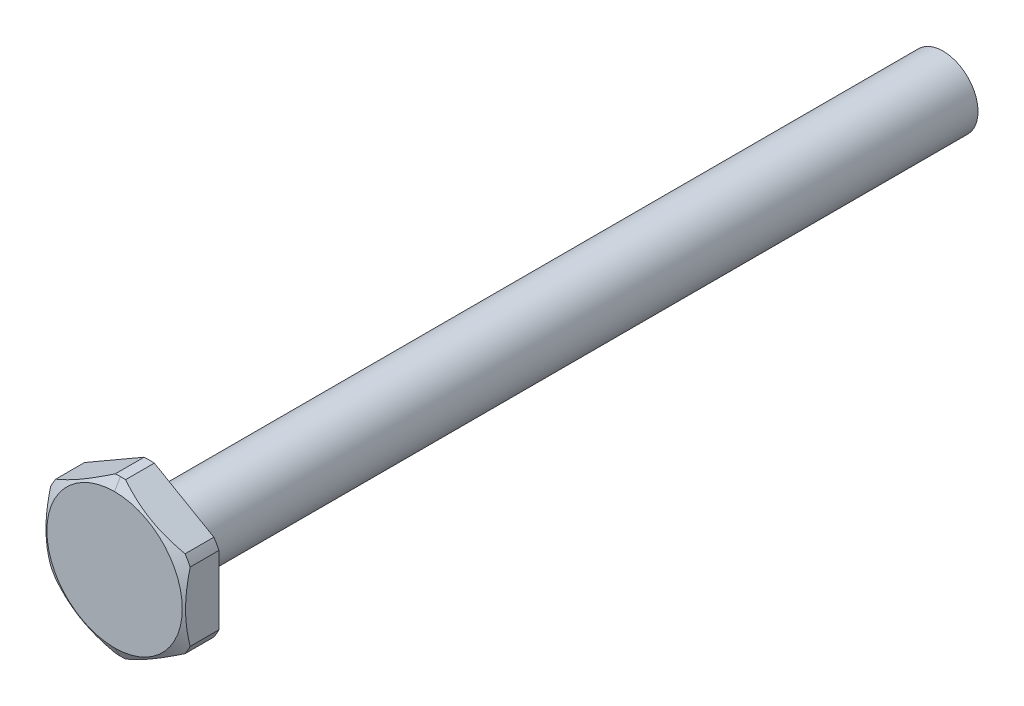
ISO-10303-21;
HEADER;
FILE_DESCRIPTION(('STEP AP214'),'2;1');
FILE_NAME('part.step','',(''),(''),'','','');
FILE_SCHEMA(('AUTOMOTIVE_DESIGN { 1 0 10303 214 1 1 1 1 }'));
ENDSEC;
DATA;
#1=APPLICATION_CONTEXT('core data for automotive mechanical design processes');
#2=APPLICATION_PROTOCOL_DEFINITION('international standard','automotive_design',2000,#1);
#3=PRODUCT_CONTEXT('',#1,'mechanical');
#4=PRODUCT('Part','Part','',(#3));
#5=PRODUCT_RELATED_PRODUCT_CATEGORY('part','',(#4));
#6=PRODUCT_DEFINITION_FORMATION('','',#4);
#7=PRODUCT_DEFINITION_CONTEXT('part definition',#1,'design');
#8=PRODUCT_DEFINITION('design','',#6,#7);
#9=PRODUCT_DEFINITION_SHAPE('','',#8);
#10=(LENGTH_UNIT() NAMED_UNIT(*) SI_UNIT(.MILLI.,.METRE.));
#11=(NAMED_UNIT(*) PLANE_ANGLE_UNIT() SI_UNIT($,.RADIAN.));
#12=(NAMED_UNIT(*) SI_UNIT($,.STERADIAN.) SOLID_ANGLE_UNIT());
#13=UNCERTAINTY_MEASURE_WITH_UNIT(LENGTH_MEASURE(1.E-05),#10,'distance_accuracy_value','');
#14=(GEOMETRIC_REPRESENTATION_CONTEXT(3) GLOBAL_UNCERTAINTY_ASSIGNED_CONTEXT((#13)) GLOBAL_UNIT_ASSIGNED_CONTEXT((#10,
#11,#12)) REPRESENTATION_CONTEXT('',''));
#15=CARTESIAN_POINT('',(0.,0.,0.));
#16=DIRECTION('',(0.,0.,1.));
#17=DIRECTION('',(1.,0.,0.));
#18=AXIS2_PLACEMENT_3D('',#15,#16,#17);
#19=CARTESIAN_POINT('',(3.175,1.83308710467704,7.9248));
#20=DIRECTION('',(0.,0.,-1.));
#21=DIRECTION('',(-1.,0.,0.));
#22=AXIS2_PLACEMENT_3D('',#19,#20,#21);
#23=PLANE('',#22);
#24=CARTESIAN_POINT('',(0.,0.,7.92479999995521));
#25=DIRECTION('',(0.,0.,-1.));
#26=DIRECTION('',(0.,1.,0.));
#27=AXIS2_PLACEMENT_3D('',#24,#25,#26);
#28=CIRCLE('',#27,3.07975000004035);
#29=CARTESIAN_POINT('',(0.,3.07975000004035,7.92479999995521));
#30=VERTEX_POINT('',#29);
#31=CARTESIAN_POINT('',(0.,-3.07975000004035,7.92479999995521));
#32=VERTEX_POINT('',#31);
#33=EDGE_CURVE('E226',#30,#32,#28,.T.);
#34=ORIENTED_EDGE('',*,*,#33,.F.);
#35=CARTESIAN_POINT('',(0.,0.,7.92479999995521));
#36=DIRECTION('',(0.,0.,-1.));
#37=DIRECTION('',(0.,1.,0.));
#38=AXIS2_PLACEMENT_3D('',#35,#36,#37);
#39=CIRCLE('',#38,3.07975000004035);
#40=EDGE_CURVE('E213',#32,#30,#39,.T.);
#41=ORIENTED_EDGE('',*,*,#40,.F.);
#42=EDGE_LOOP('',(#34,#41));
#43=FACE_BOUND('',#42,.T.);
#44=ADVANCED_FACE('F17',(#43),#23,.F.);
#45=CARTESIAN_POINT('',(0.,0.,0.));
#46=DIRECTION('',(0.,0.,-1.));
#47=DIRECTION('',(0.,1.,0.));
#48=AXIS2_PLACEMENT_3D('',#45,#46,#47);
#49=CYLINDRICAL_SURFACE('',#48,3.53917420935411);
#50=CARTESIAN_POINT('',(0.,0.,7.6595513090183));
#51=DIRECTION('',(0.,0.,-1.));
#52=DIRECTION('',(0.,1.,0.));
#53=AXIS2_PLACEMENT_3D('',#50,#51,#52);
#54=CIRCLE('',#53,3.53917420937933);
#55=CARTESIAN_POINT('',(2.94169600249883,-1.9677852304374,7.65955130902569));
#56=VERTEX_POINT('',#55);
#57=CARTESIAN_POINT('',(3.175,-1.5636908531569,7.65955130902558));
#58=VERTEX_POINT('',#57);
#59=EDGE_CURVE('E197',#56,#58,#54,.F.);
#60=ORIENTED_EDGE('',*,*,#59,.F.);
#61=DIRECTION('',(0.,0.,1.));
#62=VECTOR('',#61,1.);
#63=CARTESIAN_POINT('',(2.9416960024745,-1.96778523045144,7.9248));
#64=LINE('',#63,#62);
#65=CARTESIAN_POINT('',(2.9416960024745,-1.96778523045145,6.35));
#66=VERTEX_POINT('',#65);
#67=EDGE_CURVE('E131',#56,#66,#64,.F.);
#68=ORIENTED_EDGE('',*,*,#67,.T.);
#69=CARTESIAN_POINT('',(0.,0.,6.35));
#70=DIRECTION('',(0.,0.,-1.));
#71=DIRECTION('',(0.,1.,0.));
#72=AXIS2_PLACEMENT_3D('',#69,#70,#71);
#73=CIRCLE('',#72,3.53917420935411);
#74=CARTESIAN_POINT('',(3.175,-1.56369085312836,6.35));
#75=VERTEX_POINT('',#74);
#76=EDGE_CURVE('E123',#66,#75,#73,.F.);
#77=ORIENTED_EDGE('',*,*,#76,.T.);
#78=DIRECTION('',(0.,0.,1.));
#79=VECTOR('',#78,1.);
#80=CARTESIAN_POINT('',(3.175,-1.56369085312837,7.9248));
#81=LINE('',#80,#79);
#82=EDGE_CURVE('E128',#75,#58,#81,.T.);
#83=ORIENTED_EDGE('',*,*,#82,.T.);
#84=EDGE_LOOP('',(#60,#68,#77,#83));
#85=FACE_BOUND('',#84,.T.);
#86=ADVANCED_FACE('F127',(#85),#49,.T.);
#87=CARTESIAN_POINT('',(0.,0.,0.));
#88=DIRECTION('',(0.,0.,-1.));
#89=DIRECTION('',(0.,1.,0.));
#90=AXIS2_PLACEMENT_3D('',#87,#88,#89);
#91=CYLINDRICAL_SURFACE('',#90,3.53917420935411);
#92=CARTESIAN_POINT('',(0.,0.,7.6595513090183));
#93=DIRECTION('',(0.,0.,-1.));
#94=DIRECTION('',(0.,1.,0.));
#95=AXIS2_PLACEMENT_3D('',#92,#93,#94);
#96=CIRCLE('',#95,3.53917420937933);
#97=CARTESIAN_POINT('',(-0.23330399750118,-3.53147608359382,7.65955130902569));
#98=VERTEX_POINT('',#97);
#99=CARTESIAN_POINT('',(0.,-3.53917420937933,7.6595513090183));
#100=VERTEX_POINT('',#99);
#101=EDGE_CURVE('E209',#98,#100,#96,.F.);
#102=ORIENTED_EDGE('',*,*,#101,.F.);
#103=DIRECTION('',(0.,0.,1.));
#104=VECTOR('',#103,1.);
#105=CARTESIAN_POINT('',(-0.233303997525515,-3.53147608357976,7.9248));
#106=LINE('',#105,#104);
#107=CARTESIAN_POINT('',(-0.233303997525517,-3.53147608357977,6.35));
#108=VERTEX_POINT('',#107);
#109=EDGE_CURVE('E176',#98,#108,#106,.F.);
#110=ORIENTED_EDGE('',*,*,#109,.T.);
#111=CARTESIAN_POINT('',(0.,0.,6.35));
#112=DIRECTION('',(0.,0.,-1.));
#113=DIRECTION('',(0.,1.,0.));
#114=AXIS2_PLACEMENT_3D('',#111,#112,#113);
#115=CIRCLE('',#114,3.53917420935411);
#116=CARTESIAN_POINT('',(0.233303997525511,-3.53147608357978,6.35));
#117=VERTEX_POINT('',#116);
#118=EDGE_CURVE('E133',#108,#117,#115,.F.);
#119=ORIENTED_EDGE('',*,*,#118,.T.);
#120=DIRECTION('',(0.,0.,1.));
#121=VECTOR('',#120,1.);
#122=CARTESIAN_POINT('',(0.233303997525501,-3.53147608357978,7.9248));
#123=LINE('',#122,#121);
#124=CARTESIAN_POINT('',(0.233303997500795,-3.53147608359404,7.65955130902558));
#125=VERTEX_POINT('',#124);
#126=EDGE_CURVE('E184',#117,#125,#123,.T.);
#127=ORIENTED_EDGE('',*,*,#126,.T.);
#128=CARTESIAN_POINT('',(0.,0.,7.6595513090183));
#129=DIRECTION('',(0.,0.,-1.));
#130=DIRECTION('',(0.,1.,0.));
#131=AXIS2_PLACEMENT_3D('',#128,#129,#130);
#132=CIRCLE('',#131,3.53917420937933);
#133=EDGE_CURVE('E216',#100,#125,#132,.F.);
#134=ORIENTED_EDGE('',*,*,#133,.F.);
#135=EDGE_LOOP('',(#102,#110,#119,#127,#134));
#136=FACE_BOUND('',#135,.T.);
#137=ADVANCED_FACE('F363',(#136),#91,.T.);
#138=CARTESIAN_POINT('',(0.,0.,0.));
#139=DIRECTION('',(0.,0.,-1.));
#140=DIRECTION('',(0.,1.,0.));
#141=AXIS2_PLACEMENT_3D('',#138,#139,#140);
#142=CYLINDRICAL_SURFACE('',#141,3.53917420935411);
#143=CARTESIAN_POINT('',(0.,0.,7.6595513090183));
#144=DIRECTION('',(0.,0.,-1.));
#145=DIRECTION('',(0.,1.,0.));
#146=AXIS2_PLACEMENT_3D('',#143,#144,#145);
#147=CIRCLE('',#146,3.53917420937933);
#148=CARTESIAN_POINT('',(-3.175,-1.56369085315645,7.65955130902569));
#149=VERTEX_POINT('',#148);
#150=CARTESIAN_POINT('',(-2.94169600249922,-1.96778523043717,7.65955130902558));
#151=VERTEX_POINT('',#150);
#152=EDGE_CURVE('E206',#149,#151,#147,.F.);
#153=ORIENTED_EDGE('',*,*,#152,.F.);
#154=DIRECTION('',(0.,0.,-1.));
#155=VECTOR('',#154,1.);
#156=CARTESIAN_POINT('',(-3.175,-1.56369085312836,7.9248));
#157=LINE('',#156,#155);
#158=CARTESIAN_POINT('',(-3.175,-1.56369085312836,6.35));
#159=VERTEX_POINT('',#158);
#160=EDGE_CURVE('E169',#149,#159,#157,.T.);
#161=ORIENTED_EDGE('',*,*,#160,.T.);
#162=CARTESIAN_POINT('',(0.,0.,6.35));
#163=DIRECTION('',(0.,0.,-1.));
#164=DIRECTION('',(0.,1.,0.));
#165=AXIS2_PLACEMENT_3D('',#162,#163,#164);
#166=CIRCLE('',#165,3.53917420935411);
#167=CARTESIAN_POINT('',(-2.9416960024745,-1.96778523045144,6.35));
#168=VERTEX_POINT('',#167);
#169=EDGE_CURVE('E210',#159,#168,#166,.F.);
#170=ORIENTED_EDGE('',*,*,#169,.T.);
#171=DIRECTION('',(0.,0.,1.));
#172=VECTOR('',#171,1.);
#173=CARTESIAN_POINT('',(-2.94169600247451,-1.96778523045143,7.9248));
#174=LINE('',#173,#172);
#175=EDGE_CURVE('E180',#168,#151,#174,.T.);
#176=ORIENTED_EDGE('',*,*,#175,.T.);
#177=EDGE_LOOP('',(#153,#161,#170,#176));
#178=FACE_BOUND('',#177,.T.);
#179=ADVANCED_FACE('F326',(#178),#142,.T.);
#180=CARTESIAN_POINT('',(0.,0.,7.6595513090183));
#181=DIRECTION('',(0.,0.,-1.));
#182=DIRECTION('',(0.,1.,0.));
#183=AXIS2_PLACEMENT_3D('',#180,#181,#182);
#184=CONICAL_SURFACE('',#183,3.53917420937933,1.04719755119198);
#185=DIRECTION('',(0.,0.866025403784442,0.5));
#186=VECTOR('',#185,1.);
#187=CARTESIAN_POINT('',(6.11078570557366E-11,-499000.,-288088.081431128));
#188=LINE('',#187,#186);
#189=EDGE_CURVE('E219',#32,#100,#188,.F.);
#190=ORIENTED_EDGE('',*,*,#189,.F.);
#191=ORIENTED_EDGE('',*,*,#40,.T.);
#192=DIRECTION('',(0.,-0.866025403784442,0.5));
#193=VECTOR('',#192,1.);
#194=CARTESIAN_POINT('',(0.,499000.,-288088.081431128));
#195=LINE('',#194,#193);
#196=CARTESIAN_POINT('',(0.,3.53917420936252,7.65955130904422));
#197=VERTEX_POINT('',#196);
#198=EDGE_CURVE('E223',#197,#30,#195,.T.);
#199=ORIENTED_EDGE('',*,*,#198,.F.);
#200=CARTESIAN_POINT('',(0.,0.,7.65955130905718));
#201=DIRECTION('',(0.,0.,-1.));
#202=DIRECTION('',(0.,1.,0.));
#203=AXIS2_PLACEMENT_3D('',#200,#201,#202);
#204=CIRCLE('',#203,3.53917420935411);
#205=CARTESIAN_POINT('',(-0.233303997525434,3.53147608357978,7.65955130904502));
#206=VERTEX_POINT('',#205);
#207=EDGE_CURVE('E191',#206,#197,#204,.T.);
#208=ORIENTED_EDGE('',*,*,#207,.F.);
#209=CARTESIAN_POINT('',(-0.233303997530495,3.53147608357686,7.65955130903434));
#210=CARTESIAN_POINT('',(-0.301250191207622,3.49224733036696,7.67956301121864));
#211=CARTESIAN_POINT('',(-0.369446594343987,3.45287411865841,7.69843905888558));
#212=CARTESIAN_POINT('',(-0.506351081431492,3.37383227618518,7.73364712687011));
#213=CARTESIAN_POINT('',(-0.575059317476816,3.33416355760886,7.74997835657926));
#214=CARTESIAN_POINT('',(-0.78207498747478,3.21464300480907,7.79476452281208));
#215=CARTESIAN_POINT('',(-0.921105984556405,3.13437342121829,7.81896126616065));
#216=CARTESIAN_POINT('',(-1.19749793571269,2.97479845381636,7.85362305563511));
#217=CARTESIAN_POINT('',(-1.33483224312573,2.89550845446247,7.8643670272905));
#218=CARTESIAN_POINT('',(-1.60969008285009,2.73681920670874,7.87202933906981));
#219=CARTESIAN_POINT('',(-1.74721333603951,2.65742011945999,7.86896003682719));
#220=CARTESIAN_POINT('',(-1.97297207681322,2.52707824970238,7.85281982091612));
#221=CARTESIAN_POINT('',(-2.06143693913712,2.47600303762585,7.84367021514204));
#222=CARTESIAN_POINT('',(-2.23786472003572,2.37414241083152,7.8201092527841));
#223=CARTESIAN_POINT('',(-2.32582749543697,2.32335707877494,7.80569646472775));
#224=CARTESIAN_POINT('',(-2.50225433421137,2.22149699591627,7.77186095290141));
#225=CARTESIAN_POINT('',(-2.59070876821103,2.17042780463555,7.75237232889785));
#226=CARTESIAN_POINT('',(-2.76681961610296,2.06875015919793,7.70906456545368));
#227=CARTESIAN_POINT('',(-2.85447605399209,2.01814169118643,7.68524555668854));
#228=CARTESIAN_POINT('',(-2.94169600246949,1.9677852304543,7.65955130903435));
#229=B_SPLINE_CURVE_WITH_KNOTS('',3,(#209,#210,#211,#212,#213,#214,#215,#216,#217,#218,#219,
#220,#221,#222,#223,#224,#225,#226,#227,#228),.UNSPECIFIED.,.F.,.F.,(4,2,2,2,2,2,2,2,2,4),(0.,
0.242893576577489,0.48586246403568,0.972398485865168,1.44867015361686,1.92451582386836,
2.23206438369509,2.53969665249673,2.85154143369524,3.16337680609788),.UNSPECIFIED.);
#230=CARTESIAN_POINT('',(-2.94169600247201,1.96778523045284,7.65955130904576));
#231=VERTEX_POINT('',#230);
#232=EDGE_CURVE('E165',#206,#231,#229,.T.);
#233=ORIENTED_EDGE('',*,*,#232,.T.);
#234=CARTESIAN_POINT('',(0.,0.,7.65955130905718));
#235=DIRECTION('',(0.,0.,-1.));
#236=DIRECTION('',(0.,1.,0.));
#237=AXIS2_PLACEMENT_3D('',#234,#235,#236);
#238=CIRCLE('',#237,3.53917420935411);
#239=CARTESIAN_POINT('',(-3.175,1.56369085312837,7.65955130904501));
#240=VERTEX_POINT('',#239);
#241=EDGE_CURVE('E198',#240,#231,#238,.T.);
#242=ORIENTED_EDGE('',*,*,#241,.F.);
#243=CARTESIAN_POINT('',(-3.175,1.56369085312253,7.65955130903434));
#244=CARTESIAN_POINT('',(-3.175,1.48523334670273,7.67956301121864));
#245=CARTESIAN_POINT('',(-3.175,1.40648692328564,7.69843905888558));
#246=CARTESIAN_POINT('',(-3.175,1.24840323833916,7.7336471268701));
#247=CARTESIAN_POINT('',(-3.175,1.16906580118653,7.74997835657926));
#248=CARTESIAN_POINT('',(-3.175,0.930024695586941,7.79476452281208));
#249=CARTESIAN_POINT('',(-3.175,0.769485528405382,7.81896126616065));
#250=CARTESIAN_POINT('',(-3.175,0.450335593601525,7.8536230556351));
#251=CARTESIAN_POINT('',(-3.175,0.291755594893747,7.86436702729049));
#252=CARTESIAN_POINT('',(-3.175,-0.0256229006137178,7.8720293390698));
#253=CARTESIAN_POINT('',(-3.175,-0.184421075111211,7.86896003682718));
#254=CARTESIAN_POINT('',(-3.175,-0.44510481462684,7.85281982091608));
#255=CARTESIAN_POINT('',(-3.175,-0.547255238780314,7.84367021514196));
#256=CARTESIAN_POINT('',(-3.175,-0.750976492369792,7.82010925278387));
#257=CARTESIAN_POINT('',(-3.175,-0.852547156483361,7.80569646472744));
#258=CARTESIAN_POINT('',(-3.175,-1.05626732220152,7.77186095290087));
#259=CARTESIAN_POINT('',(-3.175,-1.15840570476337,7.7523723288972));
#260=CARTESIAN_POINT('',(-3.175,-1.36176099563942,7.70906456545274));
#261=CARTESIAN_POINT('',(-3.175,-1.46297793166281,7.68524555668745));
#262=CARTESIAN_POINT('',(-3.175,-1.56369085312747,7.65955130903309));
#263=B_SPLINE_CURVE_WITH_KNOTS('',3,(#243,#244,#245,#246,#247,#248,#249,#250,#251,#252,#253,
#254,#255,#256,#257,#258,#259,#260,#261,#262),.UNSPECIFIED.,.F.,.F.,(4,2,2,2,2,2,2,2,2,4),(0.,
0.242893576577492,0.485862464035685,0.972398485865179,1.44867015361686,1.92451582386836,
2.23206438369633,2.53969665249921,2.851541433699,3.16337680610292),.UNSPECIFIED.);
#264=EDGE_CURVE('E172',#240,#149,#263,.T.);
#265=ORIENTED_EDGE('',*,*,#264,.T.);
#266=ORIENTED_EDGE('',*,*,#152,.T.);
#267=CARTESIAN_POINT('',(-2.94169600247373,-1.96778523045189,7.65955130903308));
#268=CARTESIAN_POINT('',(-2.87374980879657,-2.0070139836618,7.67956301121744));
#269=CARTESIAN_POINT('',(-2.80555340566017,-2.04638719537037,7.69843905888444));
#270=CARTESIAN_POINT('',(-2.66864891857261,-2.12542903784364,7.73364712686909));
#271=CARTESIAN_POINT('',(-2.59994068252725,-2.16509775641998,7.74997835657831));
#272=CARTESIAN_POINT('',(-2.39292501252918,-2.28461830921983,7.79476452281132));
#273=CARTESIAN_POINT('',(-2.25389401544748,-2.36488789281065,7.81896126616002));
#274=CARTESIAN_POINT('',(-1.97750206429105,-2.52446286021266,7.85362305563474));
#275=CARTESIAN_POINT('',(-1.84016775687794,-2.60375285956659,7.86436702729026));
#276=CARTESIAN_POINT('',(-1.56530991715344,-2.76244210732041,7.87202933906982));
#277=CARTESIAN_POINT('',(-1.42778666396393,-2.84184119456921,7.86896003682731));
#278=CARTESIAN_POINT('',(-1.20202792318951,-2.97218306432723,7.85281982091638));
#279=CARTESIAN_POINT('',(-1.11356306086497,-3.02325827640413,7.84367021514227));
#280=CARTESIAN_POINT('',(-0.937135279965107,-3.12511890319919,7.82010925278422));
#281=CARTESIAN_POINT('',(-0.849172504563221,-3.17590423525614,7.80569646472778));
#282=CARTESIAN_POINT('',(-0.672745665787555,-3.27776431811554,7.77186095290117));
#283=CARTESIAN_POINT('',(-0.584291231787256,-3.32883350939663,7.75237232889745));
#284=CARTESIAN_POINT('',(-0.40818038389406,-3.43051115483498,7.70906456545289));
#285=CARTESIAN_POINT('',(-0.320523946004295,-3.48111962284684,7.68524555668753));
#286=CARTESIAN_POINT('',(-0.233303997526278,-3.53147608357933,7.65955130903309));
#287=B_SPLINE_CURVE_WITH_KNOTS('',3,(#267,#268,#269,#270,#271,#272,#273,#274,#275,#276,#277,
#278,#279,#280,#281,#282,#283,#284,#285,#286),.UNSPECIFIED.,.F.,.F.,(4,2,2,2,2,2,2,2,2,4),(0.,
0.242893576577639,0.48586246403598,0.972398485865779,1.44867015361774,1.92451582386951,
2.23206438369843,2.53969665250227,2.85154143370305,3.16337680610796),.UNSPECIFIED.);
#288=EDGE_CURVE('E179',#151,#98,#287,.T.);
#289=ORIENTED_EDGE('',*,*,#288,.T.);
#290=ORIENTED_EDGE('',*,*,#101,.T.);
#291=EDGE_LOOP('',(#190,#191,#199,#208,#233,#242,#265,#266,#289,#290));
#292=FACE_BOUND('',#291,.T.);
#293=ADVANCED_FACE('F330',(#292),#184,.T.);
#294=CARTESIAN_POINT('',(0.,0.,0.));
#295=DIRECTION('',(0.,0.,-1.));
#296=DIRECTION('',(0.,1.,0.));
#297=AXIS2_PLACEMENT_3D('',#294,#295,#296);
#298=CYLINDRICAL_SURFACE('',#297,3.53917420935411);
#299=ORIENTED_EDGE('',*,*,#241,.T.);
#300=DIRECTION('',(0.,0.,1.));
#301=VECTOR('',#300,1.);
#302=CARTESIAN_POINT('',(-2.94169600247453,1.96778523045139,7.9248));
#303=LINE('',#302,#301);
#304=CARTESIAN_POINT('',(-2.94169600247454,1.96778523045139,6.35));
#305=VERTEX_POINT('',#304);
#306=EDGE_CURVE('E162',#231,#305,#303,.F.);
#307=ORIENTED_EDGE('',*,*,#306,.T.);
#308=CARTESIAN_POINT('',(0.,0.,6.35));
#309=DIRECTION('',(0.,0.,-1.));
#310=DIRECTION('',(0.,1.,0.));
#311=AXIS2_PLACEMENT_3D('',#308,#309,#310);
#312=CIRCLE('',#311,3.53917420935411);
#313=CARTESIAN_POINT('',(-3.175,1.56369085312837,6.35));
#314=VERTEX_POINT('',#313);
#315=EDGE_CURVE('E201',#305,#314,#312,.F.);
#316=ORIENTED_EDGE('',*,*,#315,.T.);
#317=DIRECTION('',(0.,0.,-1.));
#318=VECTOR('',#317,1.);
#319=CARTESIAN_POINT('',(-3.175,1.56369085312838,7.9248));
#320=LINE('',#319,#318);
#321=EDGE_CURVE('E173',#314,#240,#320,.F.);
#322=ORIENTED_EDGE('',*,*,#321,.T.);
#323=EDGE_LOOP('',(#299,#307,#316,#322));
#324=FACE_BOUND('',#323,.T.);
#325=ADVANCED_FACE('F341',(#324),#298,.T.);
#326=CARTESIAN_POINT('',(0.,0.,0.));
#327=DIRECTION('',(0.,0.,-1.));
#328=DIRECTION('',(0.,1.,0.));
#329=AXIS2_PLACEMENT_3D('',#326,#327,#328);
#330=CYLINDRICAL_SURFACE('',#329,3.53917420935411);
#331=CARTESIAN_POINT('',(0.,0.,6.35));
#332=DIRECTION('',(0.,0.,-1.));
#333=DIRECTION('',(0.,1.,0.));
#334=AXIS2_PLACEMENT_3D('',#331,#332,#333);
#335=CIRCLE('',#334,3.53917420935411);
#336=CARTESIAN_POINT('',(3.175,1.56369085312835,6.35));
#337=VERTEX_POINT('',#336);
#338=CARTESIAN_POINT('',(2.94169600247454,1.96778523045138,6.35));
#339=VERTEX_POINT('',#338);
#340=EDGE_CURVE('E148',#337,#339,#335,.F.);
#341=ORIENTED_EDGE('',*,*,#340,.T.);
#342=DIRECTION('',(0.,0.,1.));
#343=VECTOR('',#342,1.);
#344=CARTESIAN_POINT('',(2.94169600247455,1.96778523045138,7.9248));
#345=LINE('',#344,#343);
#346=CARTESIAN_POINT('',(2.94169600249926,1.96778523043712,7.65955130902558));
#347=VERTEX_POINT('',#346);
#348=EDGE_CURVE('E160',#339,#347,#345,.T.);
#349=ORIENTED_EDGE('',*,*,#348,.T.);
#350=CARTESIAN_POINT('',(0.,0.,7.6595513090183));
#351=DIRECTION('',(0.,0.,-1.));
#352=DIRECTION('',(0.,1.,0.));
#353=AXIS2_PLACEMENT_3D('',#350,#351,#352);
#354=CIRCLE('',#353,3.53917420937933);
#355=CARTESIAN_POINT('',(3.175,1.56369085315645,7.65955130902569));
#356=VERTEX_POINT('',#355);
#357=EDGE_CURVE('E194',#356,#347,#354,.F.);
#358=ORIENTED_EDGE('',*,*,#357,.F.);
#359=DIRECTION('',(0.,0.,1.));
#360=VECTOR('',#359,1.);
#361=CARTESIAN_POINT('',(3.175,1.56369085312835,7.9248));
#362=LINE('',#361,#360);
#363=EDGE_CURVE('E186',#356,#337,#362,.F.);
#364=ORIENTED_EDGE('',*,*,#363,.T.);
#365=EDGE_LOOP('',(#341,#349,#358,#364));
#366=FACE_BOUND('',#365,.T.);
#367=ADVANCED_FACE('F257',(#366),#330,.T.);
#368=CARTESIAN_POINT('',(0.,0.,7.6595513090183));
#369=DIRECTION('',(0.,0.,-1.));
#370=DIRECTION('',(0.,1.,0.));
#371=AXIS2_PLACEMENT_3D('',#368,#369,#370);
#372=CONICAL_SURFACE('',#371,3.53917420937933,1.04719755119198);
#373=CARTESIAN_POINT('',(2.94169600247377,1.96778523045183,7.65955130903308));
#374=CARTESIAN_POINT('',(2.87374980879661,2.00701398366175,7.67956301121744));
#375=CARTESIAN_POINT('',(2.80555340566021,2.04638719537031,7.69843905888444));
#376=CARTESIAN_POINT('',(2.66864891857264,2.12542903784359,7.73364712686909));
#377=CARTESIAN_POINT('',(2.59994068252729,2.16509775641992,7.74997835657831));
#378=CARTESIAN_POINT('',(2.39292501252922,2.28461830921977,7.79476452281132));
#379=CARTESIAN_POINT('',(2.25389401544753,2.36488789281059,7.81896126616003));
#380=CARTESIAN_POINT('',(1.9775020642911,2.5244628602126,7.85362305563475));
#381=CARTESIAN_POINT('',(1.84016775687798,2.60375285956653,7.86436702729027));
#382=CARTESIAN_POINT('',(1.56530991715348,2.76244210732035,7.87202933906984));
#383=CARTESIAN_POINT('',(1.42778666396397,2.84184119456915,7.86896003682733));
#384=CARTESIAN_POINT('',(1.2020279231899,2.97218306432697,7.85281982091642));
#385=CARTESIAN_POINT('',(1.11356306086571,3.02325827640367,7.84367021514237));
#386=CARTESIAN_POINT('',(0.937135279966549,3.12511890319832,7.82010925278445));
#387=CARTESIAN_POINT('',(0.84917250456501,3.17590423525507,7.8056964647281));
#388=CARTESIAN_POINT('',(0.672745665790043,3.27776431811407,7.77186095290171));
#389=CARTESIAN_POINT('',(0.584291231790094,3.32883350939496,7.75237232889812));
#390=CARTESIAN_POINT('',(0.408180383897593,3.43051115483291,7.70906456545383));
#391=CARTESIAN_POINT('',(0.320523946008173,3.48111962284457,7.68524555668862));
#392=CARTESIAN_POINT('',(0.233303997530496,3.53147608357685,7.65955130903435));
#393=B_SPLINE_CURVE_WITH_KNOTS('',3,(#373,#374,#375,#376,#377,#378,#379,#380,#381,#382,#383,
#384,#385,#386,#387,#388,#389,#390,#391,#392),.UNSPECIFIED.,.F.,.F.,(4,2,2,2,2,2,2,2,2,4),(0.,
0.242893576577637,0.485862464035974,0.972398485865768,1.44867015361773,1.9245158238695,
2.2320643836972,2.53969665249982,2.85154143369933,3.16337680610298),.UNSPECIFIED.);
#394=CARTESIAN_POINT('',(0.233303997527975,3.53147608357832,7.65955130904576));
#395=VERTEX_POINT('',#394);
#396=EDGE_CURVE('E156',#347,#395,#393,.T.);
#397=ORIENTED_EDGE('',*,*,#396,.T.);
#398=CARTESIAN_POINT('',(0.,0.,7.65955130905718));
#399=DIRECTION('',(0.,0.,-1.));
#400=DIRECTION('',(0.,1.,0.));
#401=AXIS2_PLACEMENT_3D('',#398,#399,#400);
#402=CIRCLE('',#401,3.53917420935411);
#403=EDGE_CURVE('E188',#197,#395,#402,.T.);
#404=ORIENTED_EDGE('',*,*,#403,.F.);
#405=ORIENTED_EDGE('',*,*,#198,.T.);
#406=ORIENTED_EDGE('',*,*,#33,.T.);
#407=ORIENTED_EDGE('',*,*,#189,.T.);
#408=ORIENTED_EDGE('',*,*,#133,.T.);
#409=CARTESIAN_POINT('',(0.233303997526286,-3.53147608357933,7.65955130903308));
#410=CARTESIAN_POINT('',(0.301250191203444,-3.49224733036941,7.67956301121744));
#411=CARTESIAN_POINT('',(0.369446594339842,-3.45287411866084,7.69843905888444));
#412=CARTESIAN_POINT('',(0.506351081427412,-3.37383227618757,7.73364712686909));
#413=CARTESIAN_POINT('',(0.575059317472769,-3.33416355761124,7.74997835657831));
#414=CARTESIAN_POINT('',(0.782074987470837,-3.21464300481138,7.79476452281132));
#415=CARTESIAN_POINT('',(0.921105984552536,-3.13437342122056,7.81896126616002));
#416=CARTESIAN_POINT('',(1.19749793570897,-2.97479845381855,7.85362305563474));
#417=CARTESIAN_POINT('',(1.33483224312208,-2.89550845446462,7.86436702729026));
#418=CARTESIAN_POINT('',(1.60969008284658,-2.7368192067108,7.87202933906982));
#419=CARTESIAN_POINT('',(1.74721333603609,-2.657420119462,7.86896003682731));
#420=CARTESIAN_POINT('',(1.97297207681051,-2.52707824970398,7.85281982091638));
#421=CARTESIAN_POINT('',(2.06143693913505,-2.47600303762708,7.84367021514227));
#422=CARTESIAN_POINT('',(2.23786472003491,-2.37414241083202,7.82010925278422));
#423=CARTESIAN_POINT('',(2.3258274954368,-2.32335707877508,7.80569646472778));
#424=CARTESIAN_POINT('',(2.50225433421246,-2.22149699591567,7.77186095290117));
#425=CARTESIAN_POINT('',(2.59070876821276,-2.17042780463458,7.75237232889745));
#426=CARTESIAN_POINT('',(2.76681961610595,-2.06875015919623,7.70906456545289));
#427=CARTESIAN_POINT('',(2.85447605399572,-2.01814169118437,7.68524555668753));
#428=CARTESIAN_POINT('',(2.94169600247373,-1.96778523045189,7.65955130903309));
#429=B_SPLINE_CURVE_WITH_KNOTS('',3,(#409,#410,#411,#412,#413,#414,#415,#416,#417,#418,#419,
#420,#421,#422,#423,#424,#425,#426,#427,#428),.UNSPECIFIED.,.F.,.F.,(4,2,2,2,2,2,2,2,2,4),(0.,
0.24289357657764,0.485862464035981,0.972398485865781,1.44867015361774,1.92451582386951,
2.23206438369843,2.53969665250227,2.85154143370305,3.16337680610795),.UNSPECIFIED.);
#430=EDGE_CURVE('E183',#125,#56,#429,.T.);
#431=ORIENTED_EDGE('',*,*,#430,.T.);
#432=ORIENTED_EDGE('',*,*,#59,.T.);
#433=CARTESIAN_POINT('',(3.175,-1.56369085312747,7.65955130903308));
#434=CARTESIAN_POINT('',(3.175,-1.48523334670763,7.67956301121744));
#435=CARTESIAN_POINT('',(3.175,-1.40648692329051,7.69843905888444));
#436=CARTESIAN_POINT('',(3.175,-1.24840323834396,7.73364712686909));
#437=CARTESIAN_POINT('',(3.175,-1.16906580119129,7.74997835657831));
#438=CARTESIAN_POINT('',(3.175,-0.930024695591583,7.79476452281132));
#439=CARTESIAN_POINT('',(3.175,-0.76948552840994,7.81896126616003));
#440=CARTESIAN_POINT('',(3.175,-0.450335593605917,7.85362305563475));
#441=CARTESIAN_POINT('',(3.175,-0.291755594898056,7.86436702729027));
#442=CARTESIAN_POINT('',(3.175,0.025622900609586,7.87202933906983));
#443=CARTESIAN_POINT('',(3.175,0.184421075107173,7.86896003682733));
#444=CARTESIAN_POINT('',(3.175,0.445104814623226,7.85281982091639));
#445=CARTESIAN_POINT('',(3.175,0.547255238777027,7.84367021514228));
#446=CARTESIAN_POINT('',(3.175,0.750976492367159,7.82010925278423));
#447=CARTESIAN_POINT('',(3.175,0.852547156481053,7.80569646472779));
#448=CARTESIAN_POINT('',(3.175,1.05626732219987,7.77186095290118));
#449=CARTESIAN_POINT('',(3.175,1.15840570476205,7.75237232889746));
#450=CARTESIAN_POINT('',(3.175,1.36176099563876,7.70906456545289));
#451=CARTESIAN_POINT('',(3.175,1.46297793166249,7.68524555668753));
#452=CARTESIAN_POINT('',(3.175,1.56369085312747,7.65955130903309));
#453=B_SPLINE_CURVE_WITH_KNOTS('',3,(#433,#434,#435,#436,#437,#438,#439,#440,#441,#442,#443,
#444,#445,#446,#447,#448,#449,#450,#451,#452),.UNSPECIFIED.,.F.,.F.,(4,2,2,2,2,2,2,2,2,4),(0.,
0.24289357657764,0.485862464035981,0.97239848586578,1.44867015361774,1.92451582386951,
2.23206438369844,2.5396966525023,2.85154143370309,3.16337680610802),.UNSPECIFIED.);
#454=EDGE_CURVE('E143',#58,#356,#453,.T.);
#455=ORIENTED_EDGE('',*,*,#454,.T.);
#456=ORIENTED_EDGE('',*,*,#357,.T.);
#457=EDGE_LOOP('',(#397,#404,#405,#406,#407,#408,#431,#432,#455,#456));
#458=FACE_BOUND('',#457,.T.);
#459=ADVANCED_FACE('F251',(#458),#372,.T.);
#460=CARTESIAN_POINT('',(0.,0.,0.));
#461=DIRECTION('',(0.,0.,-1.));
#462=DIRECTION('',(0.,1.,0.));
#463=AXIS2_PLACEMENT_3D('',#460,#461,#462);
#464=CYLINDRICAL_SURFACE('',#463,3.53917420935411);
#465=CARTESIAN_POINT('',(0.,0.,6.35));
#466=DIRECTION('',(0.,0.,-1.));
#467=DIRECTION('',(0.,1.,0.));
#468=AXIS2_PLACEMENT_3D('',#465,#466,#467);
#469=CIRCLE('',#468,3.53917420935411);
#470=CARTESIAN_POINT('',(0.233303997525452,3.53147608357978,6.35));
#471=VERTEX_POINT('',#470);
#472=CARTESIAN_POINT('',(-0.233303997525444,3.53147608357978,6.35));
#473=VERTEX_POINT('',#472);
#474=EDGE_CURVE('E144',#471,#473,#469,.F.);
#475=ORIENTED_EDGE('',*,*,#474,.T.);
#476=DIRECTION('',(0.,0.,1.));
#477=VECTOR('',#476,1.);
#478=CARTESIAN_POINT('',(-0.233303997525434,3.53147608357978,7.9248));
#479=LINE('',#478,#477);
#480=EDGE_CURVE('E166',#473,#206,#479,.T.);
#481=ORIENTED_EDGE('',*,*,#480,.T.);
#482=ORIENTED_EDGE('',*,*,#207,.T.);
#483=ORIENTED_EDGE('',*,*,#403,.T.);
#484=DIRECTION('',(0.,0.,1.));
#485=VECTOR('',#484,1.);
#486=CARTESIAN_POINT('',(0.233303997525453,3.53147608357977,7.9248));
#487=LINE('',#486,#485);
#488=EDGE_CURVE('E151',#395,#471,#487,.F.);
#489=ORIENTED_EDGE('',*,*,#488,.T.);
#490=EDGE_LOOP('',(#475,#481,#482,#483,#489));
#491=FACE_BOUND('',#490,.T.);
#492=ADVANCED_FACE('F256',(#491),#464,.T.);
#493=CARTESIAN_POINT('',(3.175,-1.83308710467708,7.9248));
#494=DIRECTION('',(-1.,0.,0.));
#495=DIRECTION('',(0.,0.,1.));
#496=AXIS2_PLACEMENT_3D('',#493,#494,#495);
#497=PLANE('',#496);
#498=ORIENTED_EDGE('',*,*,#363,.F.);
#499=ORIENTED_EDGE('',*,*,#454,.F.);
#500=ORIENTED_EDGE('',*,*,#82,.F.);
#501=DIRECTION('',(0.,1.,0.));
#502=VECTOR('',#501,1.);
#503=CARTESIAN_POINT('',(3.175,1.83308710467704,6.35));
#504=LINE('',#503,#502);
#505=EDGE_CURVE('E141',#337,#75,#504,.F.);
#506=ORIENTED_EDGE('',*,*,#505,.F.);
#507=EDGE_LOOP('',(#498,#499,#500,#506));
#508=FACE_BOUND('',#507,.T.);
#509=ADVANCED_FACE('F140',(#508),#497,.F.);
#510=CARTESIAN_POINT('',(0.,-3.66617420935414,7.9248));
#511=DIRECTION('',(-0.5,0.866025403784439,0.));
#512=DIRECTION('',(-0.866025403784439,-0.5,0.));
#513=AXIS2_PLACEMENT_3D('',#510,#511,#512);
#514=PLANE('',#513);
#515=ORIENTED_EDGE('',*,*,#67,.F.);
#516=ORIENTED_EDGE('',*,*,#430,.F.);
#517=ORIENTED_EDGE('',*,*,#126,.F.);
#518=DIRECTION('',(-0.866025403784439,-0.5,0.));
#519=VECTOR('',#518,1.);
#520=CARTESIAN_POINT('',(2.94169600247452,-1.96778523045144,6.35));
#521=LINE('',#520,#519);
#522=EDGE_CURVE('E150',#66,#117,#521,.T.);
#523=ORIENTED_EDGE('',*,*,#522,.F.);
#524=EDGE_LOOP('',(#515,#516,#517,#523));
#525=FACE_BOUND('',#524,.T.);
#526=ADVANCED_FACE('F279',(#525),#514,.F.);
#527=CARTESIAN_POINT('',(-3.175,-1.83308710467708,7.9248));
#528=DIRECTION('',(0.5,0.866025403784439,0.));
#529=DIRECTION('',(-0.866025403784439,0.5,0.));
#530=AXIS2_PLACEMENT_3D('',#527,#528,#529);
#531=PLANE('',#530);
#532=ORIENTED_EDGE('',*,*,#109,.F.);
#533=ORIENTED_EDGE('',*,*,#288,.F.);
#534=ORIENTED_EDGE('',*,*,#175,.F.);
#535=DIRECTION('',(-0.866025403784439,0.5,0.));
#536=VECTOR('',#535,1.);
#537=CARTESIAN_POINT('',(-0.233303997525502,-3.53147608357978,6.35));
#538=LINE('',#537,#536);
#539=EDGE_CURVE('E153',#108,#168,#538,.T.);
#540=ORIENTED_EDGE('',*,*,#539,.F.);
#541=EDGE_LOOP('',(#532,#533,#534,#540));
#542=FACE_BOUND('',#541,.T.);
#543=ADVANCED_FACE('F282',(#542),#531,.F.);
#544=CARTESIAN_POINT('',(-3.175,1.83308710467704,7.9248));
#545=DIRECTION('',(1.,0.,0.));
#546=DIRECTION('',(0.,0.,-1.));
#547=AXIS2_PLACEMENT_3D('',#544,#545,#546);
#548=PLANE('',#547);
#549=ORIENTED_EDGE('',*,*,#160,.F.);
#550=ORIENTED_EDGE('',*,*,#264,.F.);
#551=ORIENTED_EDGE('',*,*,#321,.F.);
#552=DIRECTION('',(0.,1.,0.));
#553=VECTOR('',#552,1.);
#554=CARTESIAN_POINT('',(-3.175,1.83308710467704,6.35));
#555=LINE('',#554,#553);
#556=EDGE_CURVE('E316',#159,#314,#555,.T.);
#557=ORIENTED_EDGE('',*,*,#556,.F.);
#558=EDGE_LOOP('',(#549,#550,#551,#557));
#559=FACE_BOUND('',#558,.T.);
#560=ADVANCED_FACE('F336',(#559),#548,.F.);
#561=CARTESIAN_POINT('',(0.,3.6661742093541,7.9248));
#562=DIRECTION('',(0.5,-0.866025403784439,0.));
#563=DIRECTION('',(0.866025403784439,0.5,0.));
#564=AXIS2_PLACEMENT_3D('',#561,#562,#563);
#565=PLANE('',#564);
#566=ORIENTED_EDGE('',*,*,#306,.F.);
#567=ORIENTED_EDGE('',*,*,#232,.F.);
#568=ORIENTED_EDGE('',*,*,#480,.F.);
#569=DIRECTION('',(0.866025403784439,0.5,0.));
#570=VECTOR('',#569,1.);
#571=CARTESIAN_POINT('',(-2.94169600247456,1.96778523045138,6.35));
#572=LINE('',#571,#570);
#573=EDGE_CURVE('E313',#305,#473,#572,.T.);
#574=ORIENTED_EDGE('',*,*,#573,.F.);
#575=EDGE_LOOP('',(#566,#567,#568,#574));
#576=FACE_BOUND('',#575,.T.);
#577=ADVANCED_FACE('F345',(#576),#565,.F.);
#578=CARTESIAN_POINT('',(3.175,1.83308710467704,7.9248));
#579=DIRECTION('',(-0.5,-0.866025403784439,0.));
#580=DIRECTION('',(0.866025403784439,-0.5,0.));
#581=AXIS2_PLACEMENT_3D('',#578,#579,#580);
#582=PLANE('',#581);
#583=ORIENTED_EDGE('',*,*,#488,.F.);
#584=ORIENTED_EDGE('',*,*,#396,.F.);
#585=ORIENTED_EDGE('',*,*,#348,.F.);
#586=DIRECTION('',(0.866025403784439,-0.5,0.));
#587=VECTOR('',#586,1.);
#588=CARTESIAN_POINT('',(0.233303997525435,3.53147608357978,6.35));
#589=LINE('',#588,#587);
#590=EDGE_CURVE('E235',#471,#339,#589,.T.);
#591=ORIENTED_EDGE('',*,*,#590,.F.);
#592=EDGE_LOOP('',(#583,#584,#585,#591));
#593=FACE_BOUND('',#592,.T.);
#594=ADVANCED_FACE('F248',(#593),#582,.F.);
#595=CARTESIAN_POINT('',(3.175,1.83308710467704,6.35));
#596=DIRECTION('',(0.,0.,-1.));
#597=DIRECTION('',(-1.,0.,0.));
#598=AXIS2_PLACEMENT_3D('',#595,#596,#597);
#599=PLANE('',#598);
#600=CARTESIAN_POINT('',(0.,0.,6.35));
#601=DIRECTION('',(0.,0.,-1.));
#602=DIRECTION('',(0.,1.,0.));
#603=AXIS2_PLACEMENT_3D('',#600,#601,#602);
#604=CIRCLE('',#603,1.5875);
#605=CARTESIAN_POINT('',(0.,-1.5875,6.35));
#606=VERTEX_POINT('',#605);
#607=CARTESIAN_POINT('',(0.,1.5875,6.35));
#608=VERTEX_POINT('',#607);
#609=EDGE_CURVE('E11',#606,#608,#604,.T.);
#610=ORIENTED_EDGE('',*,*,#609,.F.);
#611=CARTESIAN_POINT('',(0.,0.,6.35));
#612=DIRECTION('',(0.,0.,-1.));
#613=DIRECTION('',(0.,1.,0.));
#614=AXIS2_PLACEMENT_3D('',#611,#612,#613);
#615=CIRCLE('',#614,1.5875);
#616=EDGE_CURVE('E35',#606,#608,#615,.F.);
#617=ORIENTED_EDGE('',*,*,#616,.T.);
#618=EDGE_LOOP('',(#610,#617));
#619=FACE_BOUND('',#618,.T.);
#620=ORIENTED_EDGE('',*,*,#474,.F.);
#621=ORIENTED_EDGE('',*,*,#590,.T.);
#622=ORIENTED_EDGE('',*,*,#340,.F.);
#623=ORIENTED_EDGE('',*,*,#505,.T.);
#624=ORIENTED_EDGE('',*,*,#76,.F.);
#625=ORIENTED_EDGE('',*,*,#522,.T.);
#626=ORIENTED_EDGE('',*,*,#118,.F.);
#627=ORIENTED_EDGE('',*,*,#539,.T.);
#628=ORIENTED_EDGE('',*,*,#169,.F.);
#629=ORIENTED_EDGE('',*,*,#556,.T.);
#630=ORIENTED_EDGE('',*,*,#315,.F.);
#631=ORIENTED_EDGE('',*,*,#573,.T.);
#632=EDGE_LOOP('',(#620,#621,#622,#623,#624,#625,#626,#627,#628,#629,#630,#631));
#633=FACE_BOUND('',#632,.T.);
#634=ADVANCED_FACE('F146',(#619,#633),#599,.T.);
#635=CARTESIAN_POINT('',(0.,0.,17.3305383275262));
#636=DIRECTION('',(0.,0.,-1.));
#637=DIRECTION('',(0.,1.,0.));
#638=AXIS2_PLACEMENT_3D('',#635,#636,#637);
#639=CYLINDRICAL_SURFACE('',#638,1.5875);
#640=DIRECTION('',(0.,0.,-1.));
#641=VECTOR('',#640,1.);
#642=CARTESIAN_POINT('',(0.,-1.5875,17.3305383275262));
#643=LINE('',#642,#641);
#644=CARTESIAN_POINT('',(0.,-1.5875,-19.05));
#645=VERTEX_POINT('',#644);
#646=EDGE_CURVE('E26',#645,#606,#643,.F.);
#647=ORIENTED_EDGE('',*,*,#646,.T.);
#648=ORIENTED_EDGE('',*,*,#609,.T.);
#649=DIRECTION('',(0.,0.,-1.));
#650=VECTOR('',#649,1.);
#651=CARTESIAN_POINT('',(0.,1.5875,17.3305383275262));
#652=LINE('',#651,#650);
#653=CARTESIAN_POINT('',(0.,1.5875,-19.05));
#654=VERTEX_POINT('',#653);
#655=EDGE_CURVE('E234',#608,#654,#652,.T.);
#656=ORIENTED_EDGE('',*,*,#655,.T.);
#657=ORIENTED_EDGE('',*,*,#655,.F.);
#658=ORIENTED_EDGE('',*,*,#616,.F.);
#659=ORIENTED_EDGE('',*,*,#646,.F.);
#660=EDGE_LOOP('',(#647,#648,#656,#657,#658,#659));
#661=FACE_BOUND('',#660,.T.);
#662=CARTESIAN_POINT('',(0.,0.,-29.7688));
#663=DIRECTION('',(0.,0.,-1.));
#664=DIRECTION('',(0.,1.,0.));
#665=AXIS2_PLACEMENT_3D('',#662,#663,#664);
#666=CIRCLE('',#665,1.5875);
#667=CARTESIAN_POINT('',(0.,1.5875,-29.7688));
#668=VERTEX_POINT('',#667);
#669=EDGE_CURVE('E134',#668,#668,#666,.T.);
#670=ORIENTED_EDGE('',*,*,#669,.F.);
#671=EDGE_LOOP('',(#670));
#672=FACE_BOUND('',#671,.T.);
#673=ADVANCED_FACE('F294',(#661,#672),#639,.T.);
#674=CARTESIAN_POINT('',(0.,0.,-29.7688));
#675=DIRECTION('',(0.,0.,-1.));
#676=DIRECTION('',(0.,1.,0.));
#677=AXIS2_PLACEMENT_3D('',#674,#675,#676);
#678=PLANE('',#677);
#679=ORIENTED_EDGE('',*,*,#669,.T.);
#680=EDGE_LOOP('',(#679));
#681=FACE_BOUND('',#680,.T.);
#682=ADVANCED_FACE('F296',(#681),#678,.T.);
#683=CLOSED_SHELL('',(#44,#86,#137,#179,#293,#325,#367,#459,#492,#509,#526,#543,#560,#577,#594,
#634,#673,#682));
#684=MANIFOLD_SOLID_BREP('B1',#683);
#685=ADVANCED_BREP_SHAPE_REPRESENTATION('',(#18,#684),#14);
#686=SHAPE_DEFINITION_REPRESENTATION(#9,#685);
ENDSEC;
END-ISO-10303-21;
